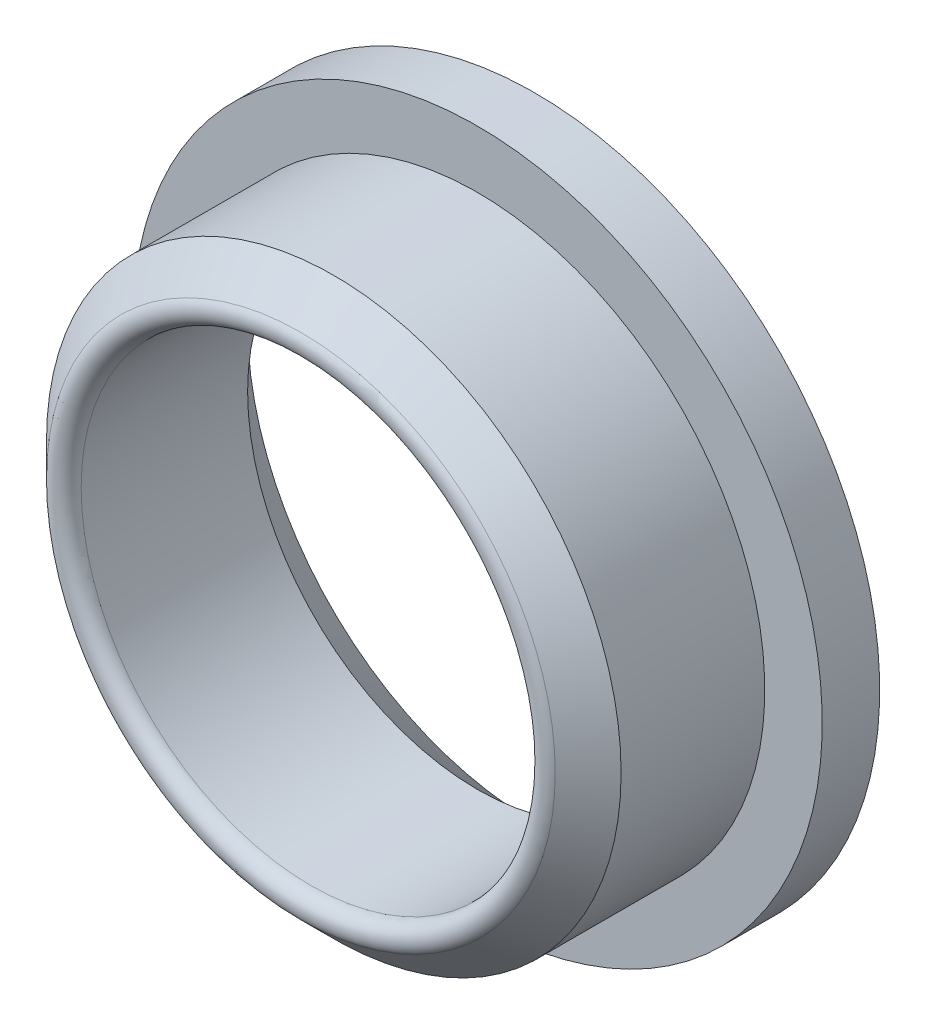
ISO-10303-21;
HEADER;
FILE_DESCRIPTION(('STEP AP214'),'2;1');
FILE_NAME('part.step','',(''),(''),'','','');
FILE_SCHEMA(('AUTOMOTIVE_DESIGN { 1 0 10303 214 1 1 1 1 }'));
ENDSEC;
DATA;
#1=APPLICATION_CONTEXT('core data for automotive mechanical design processes');
#2=APPLICATION_PROTOCOL_DEFINITION('international standard','automotive_design',2000,#1);
#3=PRODUCT_CONTEXT('',#1,'mechanical');
#4=PRODUCT('Part','Part','',(#3));
#5=PRODUCT_RELATED_PRODUCT_CATEGORY('part','',(#4));
#6=PRODUCT_DEFINITION_FORMATION('','',#4);
#7=PRODUCT_DEFINITION_CONTEXT('part definition',#1,'design');
#8=PRODUCT_DEFINITION('design','',#6,#7);
#9=PRODUCT_DEFINITION_SHAPE('','',#8);
#10=(LENGTH_UNIT() NAMED_UNIT(*) SI_UNIT(.MILLI.,.METRE.));
#11=(NAMED_UNIT(*) PLANE_ANGLE_UNIT() SI_UNIT($,.RADIAN.));
#12=(NAMED_UNIT(*) SI_UNIT($,.STERADIAN.) SOLID_ANGLE_UNIT());
#13=UNCERTAINTY_MEASURE_WITH_UNIT(LENGTH_MEASURE(1.E-05),#10,'distance_accuracy_value','');
#14=(GEOMETRIC_REPRESENTATION_CONTEXT(3) GLOBAL_UNCERTAINTY_ASSIGNED_CONTEXT((#13)) GLOBAL_UNIT_ASSIGNED_CONTEXT((#10,
#11,#12)) REPRESENTATION_CONTEXT('',''));
#15=CARTESIAN_POINT('',(0.,0.,0.));
#16=DIRECTION('',(0.,0.,1.));
#17=DIRECTION('',(1.,0.,0.));
#18=AXIS2_PLACEMENT_3D('',#15,#16,#17);
#19=CARTESIAN_POINT('',(0.,0.,0.));
#20=DIRECTION('',(0.,0.,-1.));
#21=DIRECTION('',(-1.,0.,0.));
#22=AXIS2_PLACEMENT_3D('',#19,#20,#21);
#23=CYLINDRICAL_SURFACE('',#22,8.);
#24=CARTESIAN_POINT('',(0.,0.,7.79289321881345));
#25=DIRECTION('',(0.,0.,1.));
#26=DIRECTION('',(1.,0.,0.));
#27=AXIS2_PLACEMENT_3D('',#24,#25,#26);
#28=CIRCLE('',#27,8.);
#29=CARTESIAN_POINT('',(8.,0.,7.79289321881345));
#30=VERTEX_POINT('',#29);
#31=EDGE_CURVE('E10',#30,#30,#28,.T.);
#32=ORIENTED_EDGE('',*,*,#31,.T.);
#33=EDGE_LOOP('',(#32));
#34=FACE_BOUND('',#33,.T.);
#35=CARTESIAN_POINT('',(0.,0.,2.));
#36=DIRECTION('',(0.,0.,-1.));
#37=DIRECTION('',(-1.,0.,0.));
#38=AXIS2_PLACEMENT_3D('',#35,#36,#37);
#39=CIRCLE('',#38,8.);
#40=CARTESIAN_POINT('',(-8.,0.,2.));
#41=VERTEX_POINT('',#40);
#42=EDGE_CURVE('E51',#41,#41,#39,.T.);
#43=ORIENTED_EDGE('',*,*,#42,.T.);
#44=EDGE_LOOP('',(#43));
#45=FACE_BOUND('',#44,.T.);
#46=ADVANCED_FACE('F31',(#34,#45),#23,.F.);
#47=CARTESIAN_POINT('',(-8.,0.,0.));
#48=DIRECTION('',(0.,0.,-1.));
#49=DIRECTION('',(-1.,0.,0.));
#50=AXIS2_PLACEMENT_3D('',#47,#48,#49);
#51=PLANE('',#50);
#52=CARTESIAN_POINT('',(0.,0.,0.));
#53=DIRECTION('',(0.,0.,-1.));
#54=DIRECTION('',(-1.,0.,0.));
#55=AXIS2_PLACEMENT_3D('',#52,#53,#54);
#56=CIRCLE('',#55,10.);
#57=CARTESIAN_POINT('',(-10.,0.,0.));
#58=VERTEX_POINT('',#57);
#59=EDGE_CURVE('E46',#58,#58,#56,.F.);
#60=ORIENTED_EDGE('',*,*,#59,.T.);
#61=EDGE_LOOP('',(#60));
#62=FACE_BOUND('',#61,.T.);
#63=CARTESIAN_POINT('',(0.,0.,0.));
#64=DIRECTION('',(0.,0.,-1.));
#65=DIRECTION('',(-1.,0.,0.));
#66=AXIS2_PLACEMENT_3D('',#63,#64,#65);
#67=CIRCLE('',#66,12.);
#68=CARTESIAN_POINT('',(-12.,0.,0.));
#69=VERTEX_POINT('',#68);
#70=EDGE_CURVE('E54',#69,#69,#67,.T.);
#71=ORIENTED_EDGE('',*,*,#70,.T.);
#72=EDGE_LOOP('',(#71));
#73=FACE_BOUND('',#72,.T.);
#74=ADVANCED_FACE('F82',(#62,#73),#51,.T.);
#75=CARTESIAN_POINT('',(0.,0.,0.));
#76=DIRECTION('',(0.,0.,-1.));
#77=DIRECTION('',(-1.,0.,0.));
#78=AXIS2_PLACEMENT_3D('',#75,#76,#77);
#79=CYLINDRICAL_SURFACE('',#78,12.);
#80=CARTESIAN_POINT('',(0.,0.,2.));
#81=DIRECTION('',(0.,0.,-1.));
#82=DIRECTION('',(-1.,0.,0.));
#83=AXIS2_PLACEMENT_3D('',#80,#81,#82);
#84=CIRCLE('',#83,12.);
#85=CARTESIAN_POINT('',(-12.,0.,2.));
#86=VERTEX_POINT('',#85);
#87=EDGE_CURVE('E57',#86,#86,#84,.T.);
#88=ORIENTED_EDGE('',*,*,#87,.T.);
#89=EDGE_LOOP('',(#88));
#90=FACE_BOUND('',#89,.T.);
#91=ORIENTED_EDGE('',*,*,#70,.F.);
#92=EDGE_LOOP('',(#91));
#93=FACE_BOUND('',#92,.T.);
#94=ADVANCED_FACE('F79',(#90,#93),#79,.T.);
#95=CARTESIAN_POINT('',(-12.,0.,2.));
#96=DIRECTION('',(0.,0.,1.));
#97=DIRECTION('',(1.,0.,0.));
#98=AXIS2_PLACEMENT_3D('',#95,#96,#97);
#99=PLANE('',#98);
#100=CARTESIAN_POINT('',(0.,0.,2.));
#101=DIRECTION('',(0.,0.,-1.));
#102=DIRECTION('',(-1.,0.,0.));
#103=AXIS2_PLACEMENT_3D('',#100,#101,#102);
#104=CIRCLE('',#103,10.);
#105=CARTESIAN_POINT('',(-10.,0.,2.));
#106=VERTEX_POINT('',#105);
#107=EDGE_CURVE('E60',#106,#106,#104,.T.);
#108=ORIENTED_EDGE('',*,*,#107,.T.);
#109=EDGE_LOOP('',(#108));
#110=FACE_BOUND('',#109,.T.);
#111=ORIENTED_EDGE('',*,*,#87,.F.);
#112=EDGE_LOOP('',(#111));
#113=FACE_BOUND('',#112,.T.);
#114=ADVANCED_FACE('F64',(#110,#113),#99,.T.);
#115=CARTESIAN_POINT('',(0.,0.,0.));
#116=DIRECTION('',(0.,0.,-1.));
#117=DIRECTION('',(-1.,0.,0.));
#118=AXIS2_PLACEMENT_3D('',#115,#116,#117);
#119=CYLINDRICAL_SURFACE('',#118,10.);
#120=CARTESIAN_POINT('',(0.,0.,7.00000000000001));
#121=DIRECTION('',(0.,0.,1.));
#122=DIRECTION('',(1.,0.,0.));
#123=AXIS2_PLACEMENT_3D('',#120,#121,#122);
#124=CIRCLE('',#123,10.);
#125=CARTESIAN_POINT('',(10.,0.,7.));
#126=VERTEX_POINT('',#125);
#127=EDGE_CURVE('E42',#126,#126,#124,.F.);
#128=ORIENTED_EDGE('',*,*,#127,.T.);
#129=EDGE_LOOP('',(#128));
#130=FACE_BOUND('',#129,.T.);
#131=ORIENTED_EDGE('',*,*,#107,.F.);
#132=EDGE_LOOP('',(#131));
#133=FACE_BOUND('',#132,.T.);
#134=ADVANCED_FACE('F67',(#130,#133),#119,.T.);
#135=CARTESIAN_POINT('',(0.,0.,2.));
#136=DIRECTION('',(0.,0.,-1.));
#137=DIRECTION('',(-1.,0.,0.));
#138=AXIS2_PLACEMENT_3D('',#135,#136,#137);
#139=CONICAL_SURFACE('',#138,8.,0.78539816339745);
#140=ORIENTED_EDGE('',*,*,#59,.F.);
#141=EDGE_LOOP('',(#140));
#142=FACE_BOUND('',#141,.T.);
#143=ORIENTED_EDGE('',*,*,#42,.F.);
#144=EDGE_LOOP('',(#143));
#145=FACE_BOUND('',#144,.T.);
#146=ADVANCED_FACE('F69',(#142,#145),#139,.F.);
#147=CARTESIAN_POINT('',(0.,0.,7.00000000000001));
#148=DIRECTION('',(0.,0.,-1.));
#149=DIRECTION('',(-1.,0.,0.));
#150=AXIS2_PLACEMENT_3D('',#147,#148,#149);
#151=CONICAL_SURFACE('',#150,10.,0.78539816339745);
#152=CARTESIAN_POINT('',(0.,0.,8.14644660940673));
#153=DIRECTION('',(0.,0.,1.));
#154=DIRECTION('',(1.,0.,0.));
#155=AXIS2_PLACEMENT_3D('',#152,#153,#154);
#156=CIRCLE('',#155,8.85355339059327);
#157=CARTESIAN_POINT('',(8.85355339059327,0.,8.14644660940673));
#158=VERTEX_POINT('',#157);
#159=EDGE_CURVE('E38',#158,#158,#156,.F.);
#160=ORIENTED_EDGE('',*,*,#159,.T.);
#161=EDGE_LOOP('',(#160));
#162=FACE_BOUND('',#161,.T.);
#163=ORIENTED_EDGE('',*,*,#127,.F.);
#164=EDGE_LOOP('',(#163));
#165=FACE_BOUND('',#164,.T.);
#166=ADVANCED_FACE('F76',(#162,#165),#151,.T.);
#167=CARTESIAN_POINT('',(0.,0.,7.79289321881345));
#168=DIRECTION('',(0.,0.,1.));
#169=DIRECTION('',(1.,0.,0.));
#170=AXIS2_PLACEMENT_3D('',#167,#168,#169);
#171=TOROIDAL_SURFACE('',#170,8.5,0.5);
#172=ORIENTED_EDGE('',*,*,#31,.F.);
#173=EDGE_LOOP('',(#172));
#174=FACE_BOUND('',#173,.T.);
#175=ORIENTED_EDGE('',*,*,#159,.F.);
#176=EDGE_LOOP('',(#175));
#177=FACE_BOUND('',#176,.T.);
#178=ADVANCED_FACE('F33',(#174,#177),#171,.T.);
#179=CLOSED_SHELL('',(#46,#74,#94,#114,#134,#146,#166,#178));
#180=MANIFOLD_SOLID_BREP('B2',#179);
#181=ADVANCED_BREP_SHAPE_REPRESENTATION('',(#18,#180),#14);
#182=SHAPE_DEFINITION_REPRESENTATION(#9,#181);
ENDSEC;
END-ISO-10303-21;
